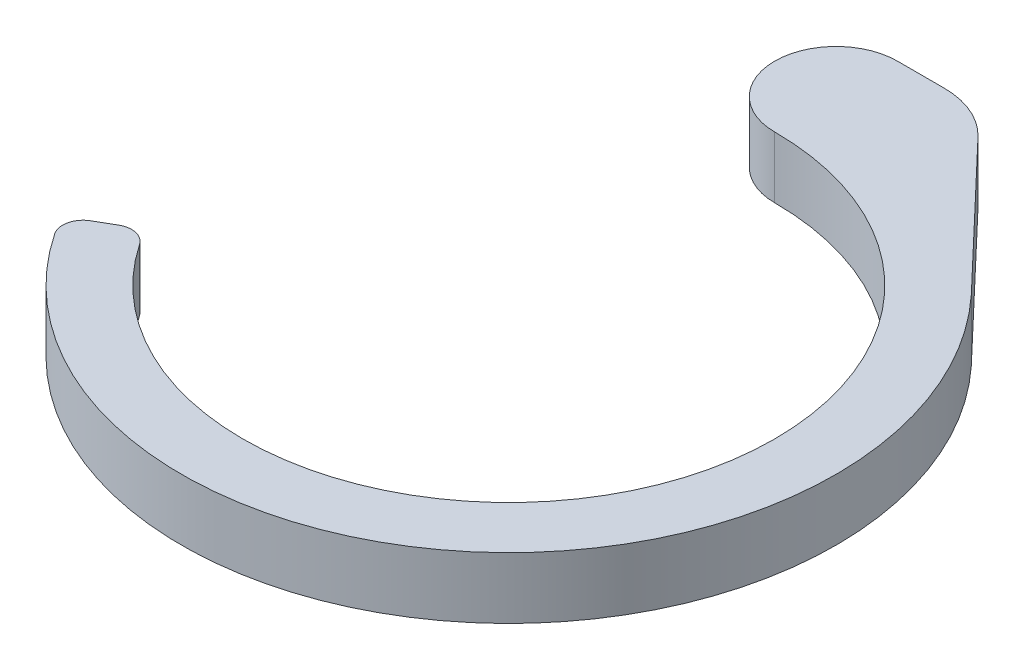
ISO-10303-21;
HEADER;
FILE_DESCRIPTION(('STEP AP214'),'2;1');
FILE_NAME('part.step','',(''),(''),'','','');
FILE_SCHEMA(('AUTOMOTIVE_DESIGN { 1 0 10303 214 1 1 1 1 }'));
ENDSEC;
DATA;
#1=APPLICATION_CONTEXT('core data for automotive mechanical design processes');
#2=APPLICATION_PROTOCOL_DEFINITION('international standard','automotive_design',2000,#1);
#3=PRODUCT_CONTEXT('',#1,'mechanical');
#4=PRODUCT('Part','Part','',(#3));
#5=PRODUCT_RELATED_PRODUCT_CATEGORY('part','',(#4));
#6=PRODUCT_DEFINITION_FORMATION('','',#4);
#7=PRODUCT_DEFINITION_CONTEXT('part definition',#1,'design');
#8=PRODUCT_DEFINITION('design','',#6,#7);
#9=PRODUCT_DEFINITION_SHAPE('','',#8);
#10=(LENGTH_UNIT() NAMED_UNIT(*) SI_UNIT(.MILLI.,.METRE.));
#11=(NAMED_UNIT(*) PLANE_ANGLE_UNIT() SI_UNIT($,.RADIAN.));
#12=(NAMED_UNIT(*) SI_UNIT($,.STERADIAN.) SOLID_ANGLE_UNIT());
#13=UNCERTAINTY_MEASURE_WITH_UNIT(LENGTH_MEASURE(1.E-05),#10,'distance_accuracy_value','');
#14=(GEOMETRIC_REPRESENTATION_CONTEXT(3) GLOBAL_UNCERTAINTY_ASSIGNED_CONTEXT((#13)) GLOBAL_UNIT_ASSIGNED_CONTEXT((#10,
#11,#12)) REPRESENTATION_CONTEXT('',''));
#15=CARTESIAN_POINT('',(0.,0.,0.));
#16=DIRECTION('',(0.,0.,1.));
#17=DIRECTION('',(1.,0.,0.));
#18=AXIS2_PLACEMENT_3D('',#15,#16,#17);
#19=CARTESIAN_POINT('',(-62.3074069840787,15.,41.7467008866615));
#20=DIRECTION('',(0.,-1.,0.));
#21=DIRECTION('',(0.,0.,-1.));
#22=AXIS2_PLACEMENT_3D('',#19,#20,#21);
#23=CYLINDRICAL_SURFACE('',#22,5.00000000000001);
#24=CARTESIAN_POINT('',(-62.3074069840787,0.,41.7467008866615));
#25=DIRECTION('',(0.,1.,0.));
#26=DIRECTION('',(0.,0.,1.));
#27=AXIS2_PLACEMENT_3D('',#24,#25,#26);
#28=CIRCLE('',#27,5.00000000000001);
#29=CARTESIAN_POINT('',(-66.4612341163506,0.,44.5298142791056));
#30=VERTEX_POINT('',#29);
#31=CARTESIAN_POINT('',(-64.8074069840787,0.,37.4165738677393));
#32=VERTEX_POINT('',#31);
#33=EDGE_CURVE('E134',#30,#32,#28,.F.);
#34=ORIENTED_EDGE('',*,*,#33,.F.);
#35=DIRECTION('',(0.,-1.,0.));
#36=VECTOR('',#35,1.);
#37=CARTESIAN_POINT('',(-66.4612341163506,15.,44.5298142791056));
#38=LINE('',#37,#36);
#39=CARTESIAN_POINT('',(-66.4612341163506,15.,44.5298142791056));
#40=VERTEX_POINT('',#39);
#41=EDGE_CURVE('E11',#40,#30,#38,.T.);
#42=ORIENTED_EDGE('',*,*,#41,.F.);
#43=CARTESIAN_POINT('',(-62.3074069840787,15.,41.7467008866615));
#44=DIRECTION('',(0.,1.,0.));
#45=DIRECTION('',(0.,0.,1.));
#46=AXIS2_PLACEMENT_3D('',#43,#44,#45);
#47=CIRCLE('',#46,5.00000000000001);
#48=CARTESIAN_POINT('',(-64.8074069840787,15.,37.4165738677393));
#49=VERTEX_POINT('',#48);
#50=EDGE_CURVE('E156',#40,#49,#47,.F.);
#51=ORIENTED_EDGE('',*,*,#50,.T.);
#52=DIRECTION('',(0.,-1.,0.));
#53=VECTOR('',#52,1.);
#54=CARTESIAN_POINT('',(-64.8074069840787,15.,37.4165738677393));
#55=LINE('',#54,#53);
#56=EDGE_CURVE('E86',#49,#32,#55,.T.);
#57=ORIENTED_EDGE('',*,*,#56,.T.);
#58=EDGE_LOOP('',(#34,#42,#51,#57));
#59=FACE_BOUND('',#58,.T.);
#60=ADVANCED_FACE('F33',(#59),#23,.T.);
#61=CARTESIAN_POINT('',(0.,15.,0.));
#62=DIRECTION('',(0.,-1.,0.));
#63=DIRECTION('',(0.,0.,-1.));
#64=AXIS2_PLACEMENT_3D('',#61,#62,#63);
#65=CYLINDRICAL_SURFACE('',#64,80.);
#66=CARTESIAN_POINT('',(0.,0.,0.));
#67=DIRECTION('',(0.,1.,0.));
#68=DIRECTION('',(0.,0.,1.));
#69=AXIS2_PLACEMENT_3D('',#66,#67,#68);
#70=CIRCLE('',#69,80.);
#71=CARTESIAN_POINT('',(58.5757297296054,0.,-54.4874654085159));
#72=VERTEX_POINT('',#71);
#73=EDGE_CURVE('E137',#30,#72,#70,.T.);
#74=ORIENTED_EDGE('',*,*,#73,.T.);
#75=DIRECTION('',(0.,-1.,0.));
#76=VECTOR('',#75,1.);
#77=CARTESIAN_POINT('',(58.5757297296054,15.,-54.4874654085159));
#78=LINE('',#77,#76);
#79=CARTESIAN_POINT('',(58.5757297296054,15.,-54.4874654085159));
#80=VERTEX_POINT('',#79);
#81=EDGE_CURVE('E41',#80,#72,#78,.T.);
#82=ORIENTED_EDGE('',*,*,#81,.F.);
#83=CARTESIAN_POINT('',(0.,15.,0.));
#84=DIRECTION('',(0.,1.,0.));
#85=DIRECTION('',(0.,0.,1.));
#86=AXIS2_PLACEMENT_3D('',#83,#84,#85);
#87=CIRCLE('',#86,80.);
#88=EDGE_CURVE('E186',#40,#80,#87,.T.);
#89=ORIENTED_EDGE('',*,*,#88,.F.);
#90=ORIENTED_EDGE('',*,*,#41,.T.);
#91=EDGE_LOOP('',(#74,#82,#89,#90));
#92=FACE_BOUND('',#91,.T.);
#93=ADVANCED_FACE('F174',(#92),#65,.T.);
#94=CARTESIAN_POINT('',(57.9325504327501,15.,-55.1629373618664));
#95=DIRECTION('',(0.724206102182212,0.,-0.689583585623996));
#96=DIRECTION('',(-0.689583585623996,0.,-0.724206102182212));
#97=AXIS2_PLACEMENT_3D('',#94,#95,#96);
#98=PLANE('',#97);
#99=DIRECTION('',(0.689583585623996,0.,0.724206102182212));
#100=VECTOR('',#99,1.);
#101=CARTESIAN_POINT('',(57.9325504327501,0.,-55.1629373618664));
#102=LINE('',#101,#100);
#103=CARTESIAN_POINT('',(25.911523347206,0.,-88.7916717124799));
#104=VERTEX_POINT('',#103);
#105=EDGE_CURVE('E140',#104,#72,#102,.T.);
#106=ORIENTED_EDGE('',*,*,#105,.F.);
#107=DIRECTION('',(0.,-1.,0.));
#108=VECTOR('',#107,1.);
#109=CARTESIAN_POINT('',(25.911523347206,15.,-88.7916717124799));
#110=LINE('',#109,#108);
#111=CARTESIAN_POINT('',(25.911523347206,15.,-88.7916717124799));
#112=VERTEX_POINT('',#111);
#113=EDGE_CURVE('E164',#112,#104,#110,.T.);
#114=ORIENTED_EDGE('',*,*,#113,.F.);
#115=DIRECTION('',(0.689583585623996,0.,0.724206102182212));
#116=VECTOR('',#115,1.);
#117=CARTESIAN_POINT('',(57.9325504327501,15.,-55.1629373618664));
#118=LINE('',#117,#116);
#119=EDGE_CURVE('E171',#112,#80,#118,.T.);
#120=ORIENTED_EDGE('',*,*,#119,.T.);
#121=ORIENTED_EDGE('',*,*,#81,.T.);
#122=EDGE_LOOP('',(#106,#114,#120,#121));
#123=FACE_BOUND('',#122,.T.);
#124=ADVANCED_FACE('F169',(#123),#98,.T.);
#125=CARTESIAN_POINT('',(11.4274013035615,15.,-75.));
#126=DIRECTION('',(0.,-1.,0.));
#127=DIRECTION('',(0.,0.,-1.));
#128=AXIS2_PLACEMENT_3D('',#125,#126,#127);
#129=CYLINDRICAL_SURFACE('',#128,20.0000000000001);
#130=CARTESIAN_POINT('',(11.4274013035615,0.,-75.));
#131=DIRECTION('',(0.,1.,0.));
#132=DIRECTION('',(0.,0.,1.));
#133=AXIS2_PLACEMENT_3D('',#130,#131,#132);
#134=CIRCLE('',#133,20.0000000000001);
#135=CARTESIAN_POINT('',(11.4274013035618,0.,-95.));
#136=VERTEX_POINT('',#135);
#137=EDGE_CURVE('E143',#136,#104,#134,.F.);
#138=ORIENTED_EDGE('',*,*,#137,.F.);
#139=DIRECTION('',(0.,-1.,0.));
#140=VECTOR('',#139,1.);
#141=CARTESIAN_POINT('',(11.4274013035618,15.,-95.));
#142=LINE('',#141,#140);
#143=CARTESIAN_POINT('',(11.4274013035618,15.,-95.));
#144=VERTEX_POINT('',#143);
#145=EDGE_CURVE('E162',#144,#136,#142,.T.);
#146=ORIENTED_EDGE('',*,*,#145,.F.);
#147=CARTESIAN_POINT('',(11.4274013035615,15.,-75.));
#148=DIRECTION('',(0.,1.,0.));
#149=DIRECTION('',(0.,0.,1.));
#150=AXIS2_PLACEMENT_3D('',#147,#148,#149);
#151=CIRCLE('',#150,20.0000000000001);
#152=EDGE_CURVE('E184',#144,#112,#151,.F.);
#153=ORIENTED_EDGE('',*,*,#152,.T.);
#154=ORIENTED_EDGE('',*,*,#113,.T.);
#155=EDGE_LOOP('',(#138,#146,#153,#154));
#156=FACE_BOUND('',#155,.T.);
#157=ADVANCED_FACE('F181',(#156),#129,.T.);
#158=CARTESIAN_POINT('',(-1.15370923512719E-13,15.,-95.));
#159=DIRECTION('',(0.,0.,-1.));
#160=DIRECTION('',(-1.,0.,0.));
#161=AXIS2_PLACEMENT_3D('',#158,#159,#160);
#162=PLANE('',#161);
#163=DIRECTION('',(1.,0.,0.));
#164=VECTOR('',#163,1.);
#165=CARTESIAN_POINT('',(-1.15370923512719E-13,0.,-95.));
#166=LINE('',#165,#164);
#167=CARTESIAN_POINT('',(0.,0.,-95.));
#168=VERTEX_POINT('',#167);
#169=EDGE_CURVE('E146',#168,#136,#166,.T.);
#170=ORIENTED_EDGE('',*,*,#169,.F.);
#171=DIRECTION('',(0.,-1.,0.));
#172=VECTOR('',#171,1.);
#173=CARTESIAN_POINT('',(0.,15.,-95.));
#174=LINE('',#173,#172);
#175=CARTESIAN_POINT('',(0.,15.,-95.));
#176=VERTEX_POINT('',#175);
#177=EDGE_CURVE('E160',#176,#168,#174,.T.);
#178=ORIENTED_EDGE('',*,*,#177,.F.);
#179=DIRECTION('',(1.,0.,0.));
#180=VECTOR('',#179,1.);
#181=CARTESIAN_POINT('',(-1.15370923512719E-13,15.,-95.));
#182=LINE('',#181,#180);
#183=EDGE_CURVE('E129',#176,#144,#182,.T.);
#184=ORIENTED_EDGE('',*,*,#183,.T.);
#185=ORIENTED_EDGE('',*,*,#145,.T.);
#186=EDGE_LOOP('',(#170,#178,#184,#185));
#187=FACE_BOUND('',#186,.T.);
#188=ADVANCED_FACE('F192',(#187),#162,.T.);
#189=CARTESIAN_POINT('',(0.,15.,-80.));
#190=DIRECTION('',(0.,-1.,0.));
#191=DIRECTION('',(0.,0.,-1.));
#192=AXIS2_PLACEMENT_3D('',#189,#190,#191);
#193=CYLINDRICAL_SURFACE('',#192,15.);
#194=CARTESIAN_POINT('',(0.,0.,-80.));
#195=DIRECTION('',(0.,1.,0.));
#196=DIRECTION('',(0.,0.,1.));
#197=AXIS2_PLACEMENT_3D('',#194,#195,#196);
#198=CIRCLE('',#197,15.);
#199=CARTESIAN_POINT('',(0.,0.,-65.));
#200=VERTEX_POINT('',#199);
#201=EDGE_CURVE('E149',#168,#200,#198,.T.);
#202=ORIENTED_EDGE('',*,*,#201,.T.);
#203=DIRECTION('',(0.,-1.,0.));
#204=VECTOR('',#203,1.);
#205=CARTESIAN_POINT('',(0.,15.,-65.));
#206=LINE('',#205,#204);
#207=CARTESIAN_POINT('',(0.,15.,-65.));
#208=VERTEX_POINT('',#207);
#209=EDGE_CURVE('E117',#208,#200,#206,.T.);
#210=ORIENTED_EDGE('',*,*,#209,.F.);
#211=CARTESIAN_POINT('',(0.,15.,-80.));
#212=DIRECTION('',(0.,1.,0.));
#213=DIRECTION('',(0.,0.,1.));
#214=AXIS2_PLACEMENT_3D('',#211,#212,#213);
#215=CIRCLE('',#214,15.);
#216=EDGE_CURVE('E126',#176,#208,#215,.T.);
#217=ORIENTED_EDGE('',*,*,#216,.F.);
#218=ORIENTED_EDGE('',*,*,#177,.T.);
#219=EDGE_LOOP('',(#202,#210,#217,#218));
#220=FACE_BOUND('',#219,.T.);
#221=ADVANCED_FACE('F194',(#220),#193,.T.);
#222=CARTESIAN_POINT('',(0.,15.,0.));
#223=DIRECTION('',(0.,-1.,0.));
#224=DIRECTION('',(0.,0.,-1.));
#225=AXIS2_PLACEMENT_3D('',#222,#223,#224);
#226=CYLINDRICAL_SURFACE('',#225,65.);
#227=CARTESIAN_POINT('',(0.,0.,0.));
#228=DIRECTION('',(0.,1.,0.));
#229=DIRECTION('',(0.,0.,1.));
#230=AXIS2_PLACEMENT_3D('',#227,#228,#229);
#231=CIRCLE('',#230,65.);
#232=CARTESIAN_POINT('',(-53.8264378899364,0.,36.4378180477484));
#233=VERTEX_POINT('',#232);
#234=EDGE_CURVE('E116',#233,#200,#231,.T.);
#235=ORIENTED_EDGE('',*,*,#234,.F.);
#236=DIRECTION('',(0.,-1.,0.));
#237=VECTOR('',#236,1.);
#238=CARTESIAN_POINT('',(-53.8264378899364,15.,36.4378180477484));
#239=LINE('',#238,#237);
#240=CARTESIAN_POINT('',(-53.8264378899364,15.,36.4378180477484));
#241=VERTEX_POINT('',#240);
#242=EDGE_CURVE('E110',#241,#233,#239,.T.);
#243=ORIENTED_EDGE('',*,*,#242,.F.);
#244=CARTESIAN_POINT('',(0.,15.,0.));
#245=DIRECTION('',(0.,1.,0.));
#246=DIRECTION('',(0.,0.,1.));
#247=AXIS2_PLACEMENT_3D('',#244,#245,#246);
#248=CIRCLE('',#247,65.);
#249=EDGE_CURVE('E114',#241,#208,#248,.T.);
#250=ORIENTED_EDGE('',*,*,#249,.T.);
#251=ORIENTED_EDGE('',*,*,#209,.T.);
#252=EDGE_LOOP('',(#235,#243,#250,#251));
#253=FACE_BOUND('',#252,.T.);
#254=ADVANCED_FACE('F112',(#253),#226,.F.);
#255=CARTESIAN_POINT('',(-57.9669331122392,15.,39.2407271283444));
#256=DIRECTION('',(0.,-1.,0.));
#257=DIRECTION('',(0.,0.,-1.));
#258=AXIS2_PLACEMENT_3D('',#255,#256,#257);
#259=CYLINDRICAL_SURFACE('',#258,5.);
#260=CARTESIAN_POINT('',(-57.9669331122392,0.,39.2407271283444));
#261=DIRECTION('',(0.,1.,0.));
#262=DIRECTION('',(0.,0.,1.));
#263=AXIS2_PLACEMENT_3D('',#260,#261,#262);
#264=CIRCLE('',#263,5.);
#265=CARTESIAN_POINT('',(-60.4669331122392,0.,34.9106001094222));
#266=VERTEX_POINT('',#265);
#267=EDGE_CURVE('E79',#233,#266,#264,.T.);
#268=ORIENTED_EDGE('',*,*,#267,.T.);
#269=DIRECTION('',(0.,-1.,0.));
#270=VECTOR('',#269,1.);
#271=CARTESIAN_POINT('',(-60.4669331122392,15.,34.9106001094222));
#272=LINE('',#271,#270);
#273=CARTESIAN_POINT('',(-60.4669331122392,15.,34.9106001094222));
#274=VERTEX_POINT('',#273);
#275=EDGE_CURVE('E118',#274,#266,#272,.T.);
#276=ORIENTED_EDGE('',*,*,#275,.F.);
#277=CARTESIAN_POINT('',(-57.9669331122392,15.,39.2407271283444));
#278=DIRECTION('',(0.,1.,0.));
#279=DIRECTION('',(0.,0.,1.));
#280=AXIS2_PLACEMENT_3D('',#277,#278,#279);
#281=CIRCLE('',#280,5.);
#282=EDGE_CURVE('E120',#241,#274,#281,.T.);
#283=ORIENTED_EDGE('',*,*,#282,.F.);
#284=ORIENTED_EDGE('',*,*,#242,.T.);
#285=EDGE_LOOP('',(#268,#276,#283,#284));
#286=FACE_BOUND('',#285,.T.);
#287=ADVANCED_FACE('F121',(#286),#259,.T.);
#288=CARTESIAN_POINT('',(0.,15.,0.));
#289=DIRECTION('',(0.499999999999997,0.,0.86602540378444));
#290=DIRECTION('',(0.86602540378444,0.,-0.499999999999997));
#291=AXIS2_PLACEMENT_3D('',#288,#289,#290);
#292=PLANE('',#291);
#293=DIRECTION('',(-0.86602540378444,0.,0.499999999999997));
#294=VECTOR('',#293,1.);
#295=CARTESIAN_POINT('',(0.,0.,0.));
#296=LINE('',#295,#294);
#297=EDGE_CURVE('E154',#266,#32,#296,.T.);
#298=ORIENTED_EDGE('',*,*,#297,.T.);
#299=ORIENTED_EDGE('',*,*,#56,.F.);
#300=DIRECTION('',(-0.86602540378444,0.,0.499999999999997));
#301=VECTOR('',#300,1.);
#302=CARTESIAN_POINT('',(0.,15.,0.));
#303=LINE('',#302,#301);
#304=EDGE_CURVE('E49',#274,#49,#303,.T.);
#305=ORIENTED_EDGE('',*,*,#304,.F.);
#306=ORIENTED_EDGE('',*,*,#275,.T.);
#307=EDGE_LOOP('',(#298,#299,#305,#306));
#308=FACE_BOUND('',#307,.T.);
#309=ADVANCED_FACE('F197',(#308),#292,.F.);
#310=CARTESIAN_POINT('',(0.,15.,0.));
#311=DIRECTION('',(0.,1.,0.));
#312=DIRECTION('',(0.,0.,1.));
#313=AXIS2_PLACEMENT_3D('',#310,#311,#312);
#314=PLANE('',#313);
#315=ORIENTED_EDGE('',*,*,#50,.F.);
#316=ORIENTED_EDGE('',*,*,#88,.T.);
#317=ORIENTED_EDGE('',*,*,#119,.F.);
#318=ORIENTED_EDGE('',*,*,#152,.F.);
#319=ORIENTED_EDGE('',*,*,#183,.F.);
#320=ORIENTED_EDGE('',*,*,#216,.T.);
#321=ORIENTED_EDGE('',*,*,#249,.F.);
#322=ORIENTED_EDGE('',*,*,#282,.T.);
#323=ORIENTED_EDGE('',*,*,#304,.T.);
#324=EDGE_LOOP('',(#315,#316,#317,#318,#319,#320,#321,#322,#323));
#325=FACE_BOUND('',#324,.T.);
#326=ADVANCED_FACE('F123',(#325),#314,.T.);
#327=CARTESIAN_POINT('',(0.,0.,0.));
#328=DIRECTION('',(0.,1.,0.));
#329=DIRECTION('',(0.,0.,1.));
#330=AXIS2_PLACEMENT_3D('',#327,#328,#329);
#331=PLANE('',#330);
#332=ORIENTED_EDGE('',*,*,#33,.T.);
#333=ORIENTED_EDGE('',*,*,#297,.F.);
#334=ORIENTED_EDGE('',*,*,#267,.F.);
#335=ORIENTED_EDGE('',*,*,#234,.T.);
#336=ORIENTED_EDGE('',*,*,#201,.F.);
#337=ORIENTED_EDGE('',*,*,#169,.T.);
#338=ORIENTED_EDGE('',*,*,#137,.T.);
#339=ORIENTED_EDGE('',*,*,#105,.T.);
#340=ORIENTED_EDGE('',*,*,#73,.F.);
#341=EDGE_LOOP('',(#332,#333,#334,#335,#336,#337,#338,#339,#340));
#342=FACE_BOUND('',#341,.T.);
#343=ADVANCED_FACE('F176',(#342),#331,.F.);
#344=CLOSED_SHELL('',(#60,#93,#124,#157,#188,#221,#254,#287,#309,#326,#343));
#345=MANIFOLD_SOLID_BREP('B2',#344);
#346=ADVANCED_BREP_SHAPE_REPRESENTATION('',(#18,#345),#14);
#347=SHAPE_DEFINITION_REPRESENTATION(#9,#346);
ENDSEC;
END-ISO-10303-21;
